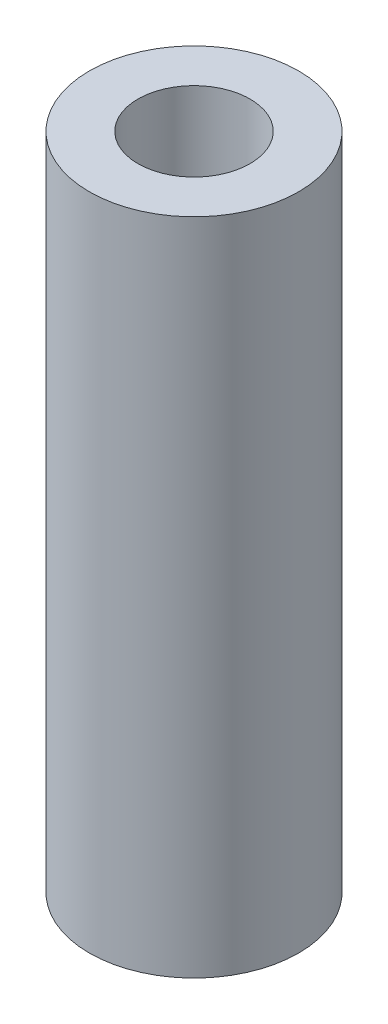
ISO-10303-21;
HEADER;
FILE_DESCRIPTION(('STEP AP214'),'2;1');
FILE_NAME('part.step','',(''),(''),'','','');
FILE_SCHEMA(('AUTOMOTIVE_DESIGN { 1 0 10303 214 1 1 1 1 }'));
ENDSEC;
DATA;
#1=APPLICATION_CONTEXT('core data for automotive mechanical design processes');
#2=APPLICATION_PROTOCOL_DEFINITION('international standard','automotive_design',2000,#1);
#3=PRODUCT_CONTEXT('',#1,'mechanical');
#4=PRODUCT('Part','Part','',(#3));
#5=PRODUCT_RELATED_PRODUCT_CATEGORY('part','',(#4));
#6=PRODUCT_DEFINITION_FORMATION('','',#4);
#7=PRODUCT_DEFINITION_CONTEXT('part definition',#1,'design');
#8=PRODUCT_DEFINITION('design','',#6,#7);
#9=PRODUCT_DEFINITION_SHAPE('','',#8);
#10=(LENGTH_UNIT() NAMED_UNIT(*) SI_UNIT(.MILLI.,.METRE.));
#11=(NAMED_UNIT(*) PLANE_ANGLE_UNIT() SI_UNIT($,.RADIAN.));
#12=(NAMED_UNIT(*) SI_UNIT($,.STERADIAN.) SOLID_ANGLE_UNIT());
#13=UNCERTAINTY_MEASURE_WITH_UNIT(LENGTH_MEASURE(1.E-05),#10,'distance_accuracy_value','');
#14=(GEOMETRIC_REPRESENTATION_CONTEXT(3) GLOBAL_UNCERTAINTY_ASSIGNED_CONTEXT((#13)) GLOBAL_UNIT_ASSIGNED_CONTEXT((#10,
#11,#12)) REPRESENTATION_CONTEXT('',''));
#15=CARTESIAN_POINT('',(0.,0.,0.));
#16=DIRECTION('',(0.,0.,1.));
#17=DIRECTION('',(1.,0.,0.));
#18=AXIS2_PLACEMENT_3D('',#15,#16,#17);
#19=CARTESIAN_POINT('',(0.,20.,0.));
#20=DIRECTION('',(0.,-1.,0.));
#21=DIRECTION('',(0.,0.,-1.));
#22=AXIS2_PLACEMENT_3D('',#19,#20,#21);
#23=CYLINDRICAL_SURFACE('',#22,3.175);
#24=CARTESIAN_POINT('',(0.,20.,0.));
#25=DIRECTION('',(0.,1.,0.));
#26=DIRECTION('',(0.,0.,1.));
#27=AXIS2_PLACEMENT_3D('',#24,#25,#26);
#28=CIRCLE('',#27,3.175);
#29=CARTESIAN_POINT('',(0.,20.,3.175));
#30=VERTEX_POINT('',#29);
#31=EDGE_CURVE('E10',#30,#30,#28,.T.);
#32=ORIENTED_EDGE('',*,*,#31,.F.);
#33=EDGE_LOOP('',(#32));
#34=FACE_BOUND('',#33,.T.);
#35=CARTESIAN_POINT('',(0.,0.,0.));
#36=DIRECTION('',(0.,1.,0.));
#37=DIRECTION('',(0.,0.,1.));
#38=AXIS2_PLACEMENT_3D('',#35,#36,#37);
#39=CIRCLE('',#38,3.175);
#40=CARTESIAN_POINT('',(0.,0.,3.175));
#41=VERTEX_POINT('',#40);
#42=EDGE_CURVE('E34',#41,#41,#39,.T.);
#43=ORIENTED_EDGE('',*,*,#42,.T.);
#44=EDGE_LOOP('',(#43));
#45=FACE_BOUND('',#44,.T.);
#46=ADVANCED_FACE('F31',(#34,#45),#23,.T.);
#47=CARTESIAN_POINT('',(0.,20.,0.));
#48=DIRECTION('',(0.,1.,0.));
#49=DIRECTION('',(0.,0.,1.));
#50=AXIS2_PLACEMENT_3D('',#47,#48,#49);
#51=PLANE('',#50);
#52=CARTESIAN_POINT('',(0.,20.,0.));
#53=DIRECTION('',(0.,1.,0.));
#54=DIRECTION('',(0.,0.,1.));
#55=AXIS2_PLACEMENT_3D('',#52,#53,#54);
#56=CIRCLE('',#55,1.7);
#57=CARTESIAN_POINT('',(0.,20.,1.7));
#58=VERTEX_POINT('',#57);
#59=EDGE_CURVE('E45',#58,#58,#56,.T.);
#60=ORIENTED_EDGE('',*,*,#59,.F.);
#61=EDGE_LOOP('',(#60));
#62=FACE_BOUND('',#61,.T.);
#63=ORIENTED_EDGE('',*,*,#31,.T.);
#64=EDGE_LOOP('',(#63));
#65=FACE_BOUND('',#64,.T.);
#66=ADVANCED_FACE('F51',(#62,#65),#51,.T.);
#67=CARTESIAN_POINT('',(0.,0.,0.));
#68=DIRECTION('',(0.,1.,0.));
#69=DIRECTION('',(0.,0.,1.));
#70=AXIS2_PLACEMENT_3D('',#67,#68,#69);
#71=PLANE('',#70);
#72=CARTESIAN_POINT('',(0.,0.,0.));
#73=DIRECTION('',(0.,1.,0.));
#74=DIRECTION('',(0.,0.,1.));
#75=AXIS2_PLACEMENT_3D('',#72,#73,#74);
#76=CIRCLE('',#75,1.7);
#77=CARTESIAN_POINT('',(0.,0.,1.7));
#78=VERTEX_POINT('',#77);
#79=EDGE_CURVE('E41',#78,#78,#76,.T.);
#80=ORIENTED_EDGE('',*,*,#79,.T.);
#81=EDGE_LOOP('',(#80));
#82=FACE_BOUND('',#81,.T.);
#83=ORIENTED_EDGE('',*,*,#42,.F.);
#84=EDGE_LOOP('',(#83));
#85=FACE_BOUND('',#84,.T.);
#86=ADVANCED_FACE('F53',(#82,#85),#71,.F.);
#87=CARTESIAN_POINT('',(0.,20.,0.));
#88=DIRECTION('',(0.,1.,0.));
#89=DIRECTION('',(0.,0.,1.));
#90=AXIS2_PLACEMENT_3D('',#87,#88,#89);
#91=CYLINDRICAL_SURFACE('',#90,1.7);
#92=ORIENTED_EDGE('',*,*,#79,.F.);
#93=EDGE_LOOP('',(#92));
#94=FACE_BOUND('',#93,.T.);
#95=ORIENTED_EDGE('',*,*,#59,.T.);
#96=EDGE_LOOP('',(#95));
#97=FACE_BOUND('',#96,.T.);
#98=ADVANCED_FACE('F49',(#94,#97),#91,.F.);
#99=CLOSED_SHELL('',(#46,#66,#86,#98));
#100=MANIFOLD_SOLID_BREP('B2',#99);
#101=ADVANCED_BREP_SHAPE_REPRESENTATION('',(#18,#100),#14);
#102=SHAPE_DEFINITION_REPRESENTATION(#9,#101);
ENDSEC;
END-ISO-10303-21;
